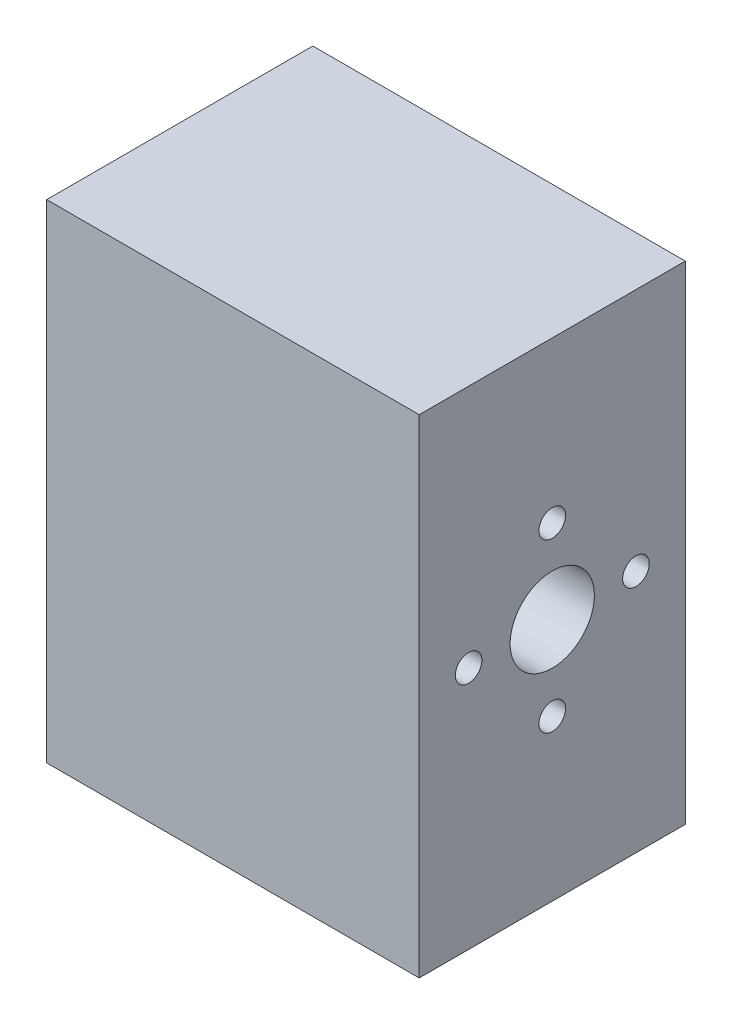
ISO-10303-21;
HEADER;
FILE_DESCRIPTION(('STEP AP214'),'2;1');
FILE_NAME('part.step','',(''),(''),'','','');
FILE_SCHEMA(('AUTOMOTIVE_DESIGN { 1 0 10303 214 1 1 1 1 }'));
ENDSEC;
DATA;
#1=APPLICATION_CONTEXT('core data for automotive mechanical design processes');
#2=APPLICATION_PROTOCOL_DEFINITION('international standard','automotive_design',2000,#1);
#3=PRODUCT_CONTEXT('',#1,'mechanical');
#4=PRODUCT('Part','Part','',(#3));
#5=PRODUCT_RELATED_PRODUCT_CATEGORY('part','',(#4));
#6=PRODUCT_DEFINITION_FORMATION('','',#4);
#7=PRODUCT_DEFINITION_CONTEXT('part definition',#1,'design');
#8=PRODUCT_DEFINITION('design','',#6,#7);
#9=PRODUCT_DEFINITION_SHAPE('','',#8);
#10=(LENGTH_UNIT() NAMED_UNIT(*) SI_UNIT(.MILLI.,.METRE.));
#11=(NAMED_UNIT(*) PLANE_ANGLE_UNIT() SI_UNIT($,.RADIAN.));
#12=(NAMED_UNIT(*) SI_UNIT($,.STERADIAN.) SOLID_ANGLE_UNIT());
#13=UNCERTAINTY_MEASURE_WITH_UNIT(LENGTH_MEASURE(1.E-05),#10,'distance_accuracy_value','');
#14=(GEOMETRIC_REPRESENTATION_CONTEXT(3) GLOBAL_UNCERTAINTY_ASSIGNED_CONTEXT((#13)) GLOBAL_UNIT_ASSIGNED_CONTEXT((#10,
#11,#12)) REPRESENTATION_CONTEXT('',''));
#15=CARTESIAN_POINT('',(0.,0.,0.));
#16=DIRECTION('',(0.,0.,1.));
#17=DIRECTION('',(1.,0.,0.));
#18=AXIS2_PLACEMENT_3D('',#15,#16,#17);
#19=CARTESIAN_POINT('',(0.,0.,30.));
#20=DIRECTION('',(1.,0.,0.));
#21=DIRECTION('',(0.,0.,-1.));
#22=AXIS2_PLACEMENT_3D('',#19,#20,#21);
#23=PLANE('',#22);
#24=CARTESIAN_POINT('',(0.,27.5,24.4344748391705));
#25=DIRECTION('',(1.,0.,0.));
#26=DIRECTION('',(0.,0.,-1.));
#27=AXIS2_PLACEMENT_3D('',#24,#25,#26);
#28=CIRCLE('',#27,1.5);
#29=CARTESIAN_POINT('',(0.,27.5,22.9344748391705));
#30=VERTEX_POINT('',#29);
#31=EDGE_CURVE('E131',#30,#30,#28,.T.);
#32=ORIENTED_EDGE('',*,*,#31,.T.);
#33=EDGE_LOOP('',(#32));
#34=FACE_BOUND('',#33,.T.);
#35=CARTESIAN_POINT('',(0.,18.0655251608295,14.9999999999999));
#36=DIRECTION('',(1.,0.,0.));
#37=DIRECTION('',(0.,0.,-1.));
#38=AXIS2_PLACEMENT_3D('',#35,#36,#37);
#39=CIRCLE('',#38,1.5);
#40=CARTESIAN_POINT('',(0.,18.0655251608295,13.4999999999999));
#41=VERTEX_POINT('',#40);
#42=EDGE_CURVE('E125',#41,#41,#39,.T.);
#43=ORIENTED_EDGE('',*,*,#42,.T.);
#44=EDGE_LOOP('',(#43));
#45=FACE_BOUND('',#44,.T.);
#46=CARTESIAN_POINT('',(0.,27.5000000000001,5.56552516082952));
#47=DIRECTION('',(1.,0.,0.));
#48=DIRECTION('',(0.,0.,-1.));
#49=AXIS2_PLACEMENT_3D('',#46,#47,#48);
#50=CIRCLE('',#49,1.5);
#51=CARTESIAN_POINT('',(0.,27.5000000000001,4.06552516082952));
#52=VERTEX_POINT('',#51);
#53=EDGE_CURVE('E119',#52,#52,#50,.T.);
#54=ORIENTED_EDGE('',*,*,#53,.T.);
#55=EDGE_LOOP('',(#54));
#56=FACE_BOUND('',#55,.T.);
#57=CARTESIAN_POINT('',(0.,36.9344748391705,15.));
#58=DIRECTION('',(1.,0.,0.));
#59=DIRECTION('',(0.,0.,-1.));
#60=AXIS2_PLACEMENT_3D('',#57,#58,#59);
#61=CIRCLE('',#60,1.5);
#62=CARTESIAN_POINT('',(0.,36.9344748391705,13.5));
#63=VERTEX_POINT('',#62);
#64=EDGE_CURVE('E113',#63,#63,#61,.T.);
#65=ORIENTED_EDGE('',*,*,#64,.T.);
#66=EDGE_LOOP('',(#65));
#67=FACE_BOUND('',#66,.T.);
#68=CARTESIAN_POINT('',(0.,27.5,15.));
#69=DIRECTION('',(1.,0.,0.));
#70=DIRECTION('',(0.,0.,-1.));
#71=AXIS2_PLACEMENT_3D('',#68,#69,#70);
#72=CIRCLE('',#71,4.75);
#73=CARTESIAN_POINT('',(0.,27.5,10.25));
#74=VERTEX_POINT('',#73);
#75=EDGE_CURVE('E99',#74,#74,#72,.T.);
#76=ORIENTED_EDGE('',*,*,#75,.T.);
#77=EDGE_LOOP('',(#76));
#78=FACE_BOUND('',#77,.T.);
#79=DIRECTION('',(0.,-1.,0.));
#80=VECTOR('',#79,1.);
#81=CARTESIAN_POINT('',(0.,0.,0.));
#82=LINE('',#81,#80);
#83=CARTESIAN_POINT('',(0.,55.,0.));
#84=VERTEX_POINT('',#83);
#85=CARTESIAN_POINT('',(0.,0.,0.));
#86=VERTEX_POINT('',#85);
#87=EDGE_CURVE('E96',#84,#86,#82,.T.);
#88=ORIENTED_EDGE('',*,*,#87,.T.);
#89=DIRECTION('',(0.,0.,-1.));
#90=VECTOR('',#89,1.);
#91=CARTESIAN_POINT('',(0.,0.,30.));
#92=LINE('',#91,#90);
#93=CARTESIAN_POINT('',(0.,0.,30.));
#94=VERTEX_POINT('',#93);
#95=EDGE_CURVE('E11',#94,#86,#92,.T.);
#96=ORIENTED_EDGE('',*,*,#95,.F.);
#97=DIRECTION('',(0.,-1.,0.));
#98=VECTOR('',#97,1.);
#99=CARTESIAN_POINT('',(0.,0.,30.));
#100=LINE('',#99,#98);
#101=CARTESIAN_POINT('',(0.,55.,30.));
#102=VERTEX_POINT('',#101);
#103=EDGE_CURVE('E84',#102,#94,#100,.T.);
#104=ORIENTED_EDGE('',*,*,#103,.F.);
#105=DIRECTION('',(0.,0.,-1.));
#106=VECTOR('',#105,1.);
#107=CARTESIAN_POINT('',(0.,55.,30.));
#108=LINE('',#107,#106);
#109=EDGE_CURVE('E92',#102,#84,#108,.T.);
#110=ORIENTED_EDGE('',*,*,#109,.T.);
#111=EDGE_LOOP('',(#88,#96,#104,#110));
#112=FACE_BOUND('',#111,.T.);
#113=ADVANCED_FACE('F33',(#34,#45,#56,#67,#78,#112),#23,.F.);
#114=CARTESIAN_POINT('',(0.,0.,30.));
#115=DIRECTION('',(0.,1.,0.));
#116=DIRECTION('',(0.,0.,1.));
#117=AXIS2_PLACEMENT_3D('',#114,#115,#116);
#118=PLANE('',#117);
#119=DIRECTION('',(1.,0.,0.));
#120=VECTOR('',#119,1.);
#121=CARTESIAN_POINT('',(0.,0.,0.));
#122=LINE('',#121,#120);
#123=CARTESIAN_POINT('',(42.,0.,0.));
#124=VERTEX_POINT('',#123);
#125=EDGE_CURVE('E88',#86,#124,#122,.T.);
#126=ORIENTED_EDGE('',*,*,#125,.T.);
#127=DIRECTION('',(0.,0.,-1.));
#128=VECTOR('',#127,1.);
#129=CARTESIAN_POINT('',(42.,0.,30.));
#130=LINE('',#129,#128);
#131=CARTESIAN_POINT('',(42.,0.,30.));
#132=VERTEX_POINT('',#131);
#133=EDGE_CURVE('E41',#132,#124,#130,.T.);
#134=ORIENTED_EDGE('',*,*,#133,.F.);
#135=DIRECTION('',(1.,0.,0.));
#136=VECTOR('',#135,1.);
#137=CARTESIAN_POINT('',(0.,0.,30.));
#138=LINE('',#137,#136);
#139=EDGE_CURVE('E79',#94,#132,#138,.T.);
#140=ORIENTED_EDGE('',*,*,#139,.F.);
#141=ORIENTED_EDGE('',*,*,#95,.T.);
#142=EDGE_LOOP('',(#126,#134,#140,#141));
#143=FACE_BOUND('',#142,.T.);
#144=ADVANCED_FACE('F87',(#143),#118,.F.);
#145=CARTESIAN_POINT('',(42.,0.,30.));
#146=DIRECTION('',(-1.,0.,0.));
#147=DIRECTION('',(0.,0.,1.));
#148=AXIS2_PLACEMENT_3D('',#145,#146,#147);
#149=PLANE('',#148);
#150=CARTESIAN_POINT('',(42.,27.5,24.4344748391705));
#151=DIRECTION('',(1.,0.,0.));
#152=DIRECTION('',(0.,0.,-1.));
#153=AXIS2_PLACEMENT_3D('',#150,#151,#152);
#154=CIRCLE('',#153,1.5);
#155=CARTESIAN_POINT('',(42.,27.5,22.9344748391705));
#156=VERTEX_POINT('',#155);
#157=EDGE_CURVE('E134',#156,#156,#154,.T.);
#158=ORIENTED_EDGE('',*,*,#157,.F.);
#159=EDGE_LOOP('',(#158));
#160=FACE_BOUND('',#159,.T.);
#161=CARTESIAN_POINT('',(42.,18.0655251608295,14.9999999999999));
#162=DIRECTION('',(1.,0.,0.));
#163=DIRECTION('',(0.,0.,-1.));
#164=AXIS2_PLACEMENT_3D('',#161,#162,#163);
#165=CIRCLE('',#164,1.5);
#166=CARTESIAN_POINT('',(42.,18.0655251608295,13.4999999999999));
#167=VERTEX_POINT('',#166);
#168=EDGE_CURVE('E128',#167,#167,#165,.T.);
#169=ORIENTED_EDGE('',*,*,#168,.F.);
#170=EDGE_LOOP('',(#169));
#171=FACE_BOUND('',#170,.T.);
#172=CARTESIAN_POINT('',(42.,27.5000000000001,5.56552516082952));
#173=DIRECTION('',(1.,0.,0.));
#174=DIRECTION('',(0.,0.,-1.));
#175=AXIS2_PLACEMENT_3D('',#172,#173,#174);
#176=CIRCLE('',#175,1.5);
#177=CARTESIAN_POINT('',(42.,27.5000000000001,4.06552516082952));
#178=VERTEX_POINT('',#177);
#179=EDGE_CURVE('E122',#178,#178,#176,.T.);
#180=ORIENTED_EDGE('',*,*,#179,.F.);
#181=EDGE_LOOP('',(#180));
#182=FACE_BOUND('',#181,.T.);
#183=CARTESIAN_POINT('',(42.,36.9344748391705,15.));
#184=DIRECTION('',(1.,0.,0.));
#185=DIRECTION('',(0.,0.,-1.));
#186=AXIS2_PLACEMENT_3D('',#183,#184,#185);
#187=CIRCLE('',#186,1.5);
#188=CARTESIAN_POINT('',(42.,36.9344748391705,13.5));
#189=VERTEX_POINT('',#188);
#190=EDGE_CURVE('E116',#189,#189,#187,.T.);
#191=ORIENTED_EDGE('',*,*,#190,.F.);
#192=EDGE_LOOP('',(#191));
#193=FACE_BOUND('',#192,.T.);
#194=CARTESIAN_POINT('',(42.,27.5,15.));
#195=DIRECTION('',(1.,0.,0.));
#196=DIRECTION('',(0.,0.,-1.));
#197=AXIS2_PLACEMENT_3D('',#194,#195,#196);
#198=CIRCLE('',#197,4.75);
#199=CARTESIAN_POINT('',(42.,27.5,10.25));
#200=VERTEX_POINT('',#199);
#201=EDGE_CURVE('E110',#200,#200,#198,.T.);
#202=ORIENTED_EDGE('',*,*,#201,.F.);
#203=EDGE_LOOP('',(#202));
#204=FACE_BOUND('',#203,.T.);
#205=DIRECTION('',(0.,1.,0.));
#206=VECTOR('',#205,1.);
#207=CARTESIAN_POINT('',(42.,0.,0.));
#208=LINE('',#207,#206);
#209=CARTESIAN_POINT('',(42.,55.,0.));
#210=VERTEX_POINT('',#209);
#211=EDGE_CURVE('E66',#124,#210,#208,.T.);
#212=ORIENTED_EDGE('',*,*,#211,.T.);
#213=DIRECTION('',(0.,0.,-1.));
#214=VECTOR('',#213,1.);
#215=CARTESIAN_POINT('',(42.,55.,30.));
#216=LINE('',#215,#214);
#217=CARTESIAN_POINT('',(42.,55.,30.));
#218=VERTEX_POINT('',#217);
#219=EDGE_CURVE('E89',#218,#210,#216,.T.);
#220=ORIENTED_EDGE('',*,*,#219,.F.);
#221=DIRECTION('',(0.,1.,0.));
#222=VECTOR('',#221,1.);
#223=CARTESIAN_POINT('',(42.,0.,30.));
#224=LINE('',#223,#222);
#225=EDGE_CURVE('E82',#132,#218,#224,.T.);
#226=ORIENTED_EDGE('',*,*,#225,.F.);
#227=ORIENTED_EDGE('',*,*,#133,.T.);
#228=EDGE_LOOP('',(#212,#220,#226,#227));
#229=FACE_BOUND('',#228,.T.);
#230=ADVANCED_FACE('F90',(#160,#171,#182,#193,#204,#229),#149,.F.);
#231=CARTESIAN_POINT('',(0.,55.,30.));
#232=DIRECTION('',(0.,-1.,0.));
#233=DIRECTION('',(0.,0.,-1.));
#234=AXIS2_PLACEMENT_3D('',#231,#232,#233);
#235=PLANE('',#234);
#236=DIRECTION('',(-1.,0.,0.));
#237=VECTOR('',#236,1.);
#238=CARTESIAN_POINT('',(0.,55.,0.));
#239=LINE('',#238,#237);
#240=EDGE_CURVE('E72',#210,#84,#239,.T.);
#241=ORIENTED_EDGE('',*,*,#240,.T.);
#242=ORIENTED_EDGE('',*,*,#109,.F.);
#243=DIRECTION('',(-1.,0.,0.));
#244=VECTOR('',#243,1.);
#245=CARTESIAN_POINT('',(0.,55.,30.));
#246=LINE('',#245,#244);
#247=EDGE_CURVE('E49',#218,#102,#246,.T.);
#248=ORIENTED_EDGE('',*,*,#247,.F.);
#249=ORIENTED_EDGE('',*,*,#219,.T.);
#250=EDGE_LOOP('',(#241,#242,#248,#249));
#251=FACE_BOUND('',#250,.T.);
#252=ADVANCED_FACE('F104',(#251),#235,.F.);
#253=CARTESIAN_POINT('',(0.,0.,30.));
#254=DIRECTION('',(0.,0.,-1.));
#255=DIRECTION('',(-1.,0.,0.));
#256=AXIS2_PLACEMENT_3D('',#253,#254,#255);
#257=PLANE('',#256);
#258=ORIENTED_EDGE('',*,*,#103,.T.);
#259=ORIENTED_EDGE('',*,*,#139,.T.);
#260=ORIENTED_EDGE('',*,*,#225,.T.);
#261=ORIENTED_EDGE('',*,*,#247,.T.);
#262=EDGE_LOOP('',(#258,#259,#260,#261));
#263=FACE_BOUND('',#262,.T.);
#264=ADVANCED_FACE('F80',(#263),#257,.F.);
#265=CARTESIAN_POINT('',(0.,0.,0.));
#266=DIRECTION('',(0.,0.,-1.));
#267=DIRECTION('',(-1.,0.,0.));
#268=AXIS2_PLACEMENT_3D('',#265,#266,#267);
#269=PLANE('',#268);
#270=ORIENTED_EDGE('',*,*,#87,.F.);
#271=ORIENTED_EDGE('',*,*,#240,.F.);
#272=ORIENTED_EDGE('',*,*,#211,.F.);
#273=ORIENTED_EDGE('',*,*,#125,.F.);
#274=EDGE_LOOP('',(#270,#271,#272,#273));
#275=FACE_BOUND('',#274,.T.);
#276=ADVANCED_FACE('F107',(#275),#269,.T.);
#277=CARTESIAN_POINT('',(0.,27.5,15.));
#278=DIRECTION('',(1.,0.,0.));
#279=DIRECTION('',(0.,0.,-1.));
#280=AXIS2_PLACEMENT_3D('',#277,#278,#279);
#281=CYLINDRICAL_SURFACE('',#280,4.75);
#282=CARTESIAN_POINT('',(0.,27.5,10.25));
#283=CARTESIAN_POINT('',(0.437499999999999,27.5,10.25));
#284=CARTESIAN_POINT('',(0.875,27.5,10.25));
#285=CARTESIAN_POINT('',(1.75,27.5,10.25));
#286=CARTESIAN_POINT('',(2.1875,27.5,10.25));
#287=CARTESIAN_POINT('',(3.0625,27.5,10.25));
#288=CARTESIAN_POINT('',(3.5,27.5,10.25));
#289=CARTESIAN_POINT('',(4.375,27.5,10.25));
#290=CARTESIAN_POINT('',(4.8125,27.5,10.25));
#291=CARTESIAN_POINT('',(5.6875,27.5,10.25));
#292=CARTESIAN_POINT('',(6.125,27.5,10.25));
#293=CARTESIAN_POINT('',(7.,27.5,10.25));
#294=CARTESIAN_POINT('',(7.4375,27.5,10.25));
#295=CARTESIAN_POINT('',(8.3125,27.5,10.25));
#296=CARTESIAN_POINT('',(8.75,27.5,10.25));
#297=CARTESIAN_POINT('',(9.625,27.5,10.25));
#298=CARTESIAN_POINT('',(10.0625,27.5,10.25));
#299=CARTESIAN_POINT('',(10.9375,27.5,10.25));
#300=CARTESIAN_POINT('',(11.375,27.5,10.25));
#301=CARTESIAN_POINT('',(12.25,27.5,10.25));
#302=CARTESIAN_POINT('',(12.6875,27.5,10.25));
#303=CARTESIAN_POINT('',(13.5625,27.5,10.25));
#304=CARTESIAN_POINT('',(14.,27.5,10.25));
#305=CARTESIAN_POINT('',(14.875,27.5,10.25));
#306=CARTESIAN_POINT('',(15.3125,27.5,10.25));
#307=CARTESIAN_POINT('',(16.1875,27.5,10.25));
#308=CARTESIAN_POINT('',(16.625,27.5,10.25));
#309=CARTESIAN_POINT('',(17.5,27.5,10.25));
#310=CARTESIAN_POINT('',(17.9375,27.5,10.25));
#311=CARTESIAN_POINT('',(18.8125,27.5,10.25));
#312=CARTESIAN_POINT('',(19.25,27.5,10.25));
#313=CARTESIAN_POINT('',(20.125,27.5,10.25));
#314=CARTESIAN_POINT('',(20.5625,27.5,10.25));
#315=CARTESIAN_POINT('',(21.4375,27.5,10.25));
#316=CARTESIAN_POINT('',(21.875,27.5,10.25));
#317=CARTESIAN_POINT('',(22.75,27.5,10.25));
#318=CARTESIAN_POINT('',(23.1875,27.5,10.25));
#319=CARTESIAN_POINT('',(24.0625,27.5,10.25));
#320=CARTESIAN_POINT('',(24.5,27.5,10.25));
#321=CARTESIAN_POINT('',(25.375,27.5,10.25));
#322=CARTESIAN_POINT('',(25.8125,27.5,10.25));
#323=CARTESIAN_POINT('',(26.6875,27.5,10.25));
#324=CARTESIAN_POINT('',(27.125,27.5,10.25));
#325=CARTESIAN_POINT('',(28.,27.5,10.25));
#326=CARTESIAN_POINT('',(28.4375,27.5,10.25));
#327=CARTESIAN_POINT('',(29.3125,27.5,10.25));
#328=CARTESIAN_POINT('',(29.75,27.5,10.25));
#329=CARTESIAN_POINT('',(30.625,27.5,10.25));
#330=CARTESIAN_POINT('',(31.0625,27.5,10.25));
#331=CARTESIAN_POINT('',(31.9375,27.5,10.25));
#332=CARTESIAN_POINT('',(32.375,27.5,10.25));
#333=CARTESIAN_POINT('',(33.25,27.5,10.25));
#334=CARTESIAN_POINT('',(33.6875,27.5,10.25));
#335=CARTESIAN_POINT('',(34.5625,27.5,10.25));
#336=CARTESIAN_POINT('',(35.,27.5,10.25));
#337=CARTESIAN_POINT('',(35.875,27.5,10.25));
#338=CARTESIAN_POINT('',(36.3125,27.5,10.25));
#339=CARTESIAN_POINT('',(37.1875,27.5,10.25));
#340=CARTESIAN_POINT('',(37.625,27.5,10.25));
#341=CARTESIAN_POINT('',(38.5,27.5,10.25));
#342=CARTESIAN_POINT('',(38.9375,27.5,10.25));
#343=CARTESIAN_POINT('',(39.8125,27.5,10.25));
#344=CARTESIAN_POINT('',(40.25,27.5,10.25));
#345=CARTESIAN_POINT('',(41.125,27.5,10.25));
#346=CARTESIAN_POINT('',(41.5625,27.5,10.25));
#347=CARTESIAN_POINT('',(42.,27.5,10.25));
#348=B_SPLINE_CURVE_WITH_KNOTS('',3,(#282,#283,#284,#285,#286,#287,#288,#289,#290,#291,#292,
#293,#294,#295,#296,#297,#298,#299,#300,#301,#302,#303,#304,#305,#306,#307,#308,#309,#310,#311,
#312,#313,#314,#315,#316,#317,#318,#319,#320,#321,#322,#323,#324,#325,#326,#327,#328,#329,#330,
#331,#332,#333,#334,#335,#336,#337,#338,#339,#340,#341,#342,#343,#344,#345,#346,#347),
.UNSPECIFIED.,.F.,.F.,(4,2,2,2,2,2,2,2,2,2,2,2,2,2,2,2,2,2,2,2,2,2,2,2,2,2,2,2,2,2,2,2,4),(0.,
1.3125,2.625,3.9375,5.25,6.5625,7.875,9.1875,10.5,11.8125,13.125,14.4375,15.75,17.0625,18.375,
19.6875,21.,22.3125,23.625,24.9375,26.25,27.5625,28.875,30.1875,31.5,32.8125,34.125,35.4375,
36.75,38.0625,39.375,40.6875,42.),.UNSPECIFIED.);
#349=EDGE_CURVE('BSEAM160',#74,#200,#348,.T.);
#350=ORIENTED_EDGE('',*,*,#75,.F.);
#351=ORIENTED_EDGE('',*,*,#201,.T.);
#352=ORIENTED_EDGE('',*,*,#349,.T.);
#353=ORIENTED_EDGE('',*,*,#349,.F.);
#354=EDGE_LOOP('',(#350,#352,#351,#353));
#355=FACE_BOUND('',#354,.T.);
#356=ADVANCED_FACE('F160',(#355),#281,.F.);
#357=CARTESIAN_POINT('',(0.,36.9344748391705,15.));
#358=DIRECTION('',(1.,0.,0.));
#359=DIRECTION('',(0.,0.,-1.));
#360=AXIS2_PLACEMENT_3D('',#357,#358,#359);
#361=CYLINDRICAL_SURFACE('',#360,1.5);
#362=CARTESIAN_POINT('',(0.,36.9344748391705,13.5));
#363=CARTESIAN_POINT('',(0.437499999999999,36.9344748391705,13.5));
#364=CARTESIAN_POINT('',(0.875,36.9344748391705,13.5));
#365=CARTESIAN_POINT('',(1.75,36.9344748391705,13.5));
#366=CARTESIAN_POINT('',(2.1875,36.9344748391705,13.5));
#367=CARTESIAN_POINT('',(3.0625,36.9344748391705,13.5));
#368=CARTESIAN_POINT('',(3.5,36.9344748391705,13.5));
#369=CARTESIAN_POINT('',(4.375,36.9344748391705,13.5));
#370=CARTESIAN_POINT('',(4.8125,36.9344748391705,13.5));
#371=CARTESIAN_POINT('',(5.6875,36.9344748391705,13.5));
#372=CARTESIAN_POINT('',(6.125,36.9344748391705,13.5));
#373=CARTESIAN_POINT('',(7.,36.9344748391705,13.5));
#374=CARTESIAN_POINT('',(7.4375,36.9344748391705,13.5));
#375=CARTESIAN_POINT('',(8.3125,36.9344748391705,13.5));
#376=CARTESIAN_POINT('',(8.75,36.9344748391705,13.5));
#377=CARTESIAN_POINT('',(9.625,36.9344748391705,13.5));
#378=CARTESIAN_POINT('',(10.0625,36.9344748391705,13.5));
#379=CARTESIAN_POINT('',(10.9375,36.9344748391705,13.5));
#380=CARTESIAN_POINT('',(11.375,36.9344748391705,13.5));
#381=CARTESIAN_POINT('',(12.25,36.9344748391705,13.5));
#382=CARTESIAN_POINT('',(12.6875,36.9344748391705,13.5));
#383=CARTESIAN_POINT('',(13.5625,36.9344748391705,13.5));
#384=CARTESIAN_POINT('',(14.,36.9344748391705,13.5));
#385=CARTESIAN_POINT('',(14.875,36.9344748391705,13.5));
#386=CARTESIAN_POINT('',(15.3125,36.9344748391705,13.5));
#387=CARTESIAN_POINT('',(16.1875,36.9344748391705,13.5));
#388=CARTESIAN_POINT('',(16.625,36.9344748391705,13.5));
#389=CARTESIAN_POINT('',(17.5,36.9344748391705,13.5));
#390=CARTESIAN_POINT('',(17.9375,36.9344748391705,13.5));
#391=CARTESIAN_POINT('',(18.8125,36.9344748391705,13.5));
#392=CARTESIAN_POINT('',(19.25,36.9344748391705,13.5));
#393=CARTESIAN_POINT('',(20.125,36.9344748391705,13.5));
#394=CARTESIAN_POINT('',(20.5625,36.9344748391705,13.5));
#395=CARTESIAN_POINT('',(21.4375,36.9344748391705,13.5));
#396=CARTESIAN_POINT('',(21.875,36.9344748391705,13.5));
#397=CARTESIAN_POINT('',(22.75,36.9344748391705,13.5));
#398=CARTESIAN_POINT('',(23.1875,36.9344748391705,13.5));
#399=CARTESIAN_POINT('',(24.0625,36.9344748391705,13.5));
#400=CARTESIAN_POINT('',(24.5,36.9344748391705,13.5));
#401=CARTESIAN_POINT('',(25.375,36.9344748391705,13.5));
#402=CARTESIAN_POINT('',(25.8125,36.9344748391705,13.5));
#403=CARTESIAN_POINT('',(26.6875,36.9344748391705,13.5));
#404=CARTESIAN_POINT('',(27.125,36.9344748391705,13.5));
#405=CARTESIAN_POINT('',(28.,36.9344748391705,13.5));
#406=CARTESIAN_POINT('',(28.4375,36.9344748391705,13.5));
#407=CARTESIAN_POINT('',(29.3125,36.9344748391705,13.5));
#408=CARTESIAN_POINT('',(29.75,36.9344748391705,13.5));
#409=CARTESIAN_POINT('',(30.625,36.9344748391705,13.5));
#410=CARTESIAN_POINT('',(31.0625,36.9344748391705,13.5));
#411=CARTESIAN_POINT('',(31.9375,36.9344748391705,13.5));
#412=CARTESIAN_POINT('',(32.375,36.9344748391705,13.5));
#413=CARTESIAN_POINT('',(33.25,36.9344748391705,13.5));
#414=CARTESIAN_POINT('',(33.6875,36.9344748391705,13.5));
#415=CARTESIAN_POINT('',(34.5625,36.9344748391705,13.5));
#416=CARTESIAN_POINT('',(35.,36.9344748391705,13.5));
#417=CARTESIAN_POINT('',(35.875,36.9344748391705,13.5));
#418=CARTESIAN_POINT('',(36.3125,36.9344748391705,13.5));
#419=CARTESIAN_POINT('',(37.1875,36.9344748391705,13.5));
#420=CARTESIAN_POINT('',(37.625,36.9344748391705,13.5));
#421=CARTESIAN_POINT('',(38.5,36.9344748391705,13.5));
#422=CARTESIAN_POINT('',(38.9375,36.9344748391705,13.5));
#423=CARTESIAN_POINT('',(39.8125,36.9344748391705,13.5));
#424=CARTESIAN_POINT('',(40.25,36.9344748391705,13.5));
#425=CARTESIAN_POINT('',(41.125,36.9344748391705,13.5));
#426=CARTESIAN_POINT('',(41.5625,36.9344748391705,13.5));
#427=CARTESIAN_POINT('',(42.,36.9344748391705,13.5));
#428=B_SPLINE_CURVE_WITH_KNOTS('',3,(#362,#363,#364,#365,#366,#367,#368,#369,#370,#371,#372,
#373,#374,#375,#376,#377,#378,#379,#380,#381,#382,#383,#384,#385,#386,#387,#388,#389,#390,#391,
#392,#393,#394,#395,#396,#397,#398,#399,#400,#401,#402,#403,#404,#405,#406,#407,#408,#409,#410,
#411,#412,#413,#414,#415,#416,#417,#418,#419,#420,#421,#422,#423,#424,#425,#426,#427),
.UNSPECIFIED.,.F.,.F.,(4,2,2,2,2,2,2,2,2,2,2,2,2,2,2,2,2,2,2,2,2,2,2,2,2,2,2,2,2,2,2,2,4),(0.,
1.3125,2.625,3.9375,5.25,6.5625,7.875,9.1875,10.5,11.8125,13.125,14.4375,15.75,17.0625,18.375,
19.6875,21.,22.3125,23.625,24.9375,26.25,27.5625,28.875,30.1875,31.5,32.8125,34.125,35.4375,
36.75,38.0625,39.375,40.6875,42.),.UNSPECIFIED.);
#429=EDGE_CURVE('BSEAM162',#63,#189,#428,.T.);
#430=ORIENTED_EDGE('',*,*,#64,.F.);
#431=ORIENTED_EDGE('',*,*,#190,.T.);
#432=ORIENTED_EDGE('',*,*,#429,.T.);
#433=ORIENTED_EDGE('',*,*,#429,.F.);
#434=EDGE_LOOP('',(#430,#432,#431,#433));
#435=FACE_BOUND('',#434,.T.);
#436=ADVANCED_FACE('F162',(#435),#361,.F.);
#437=CARTESIAN_POINT('',(0.,27.5000000000001,5.56552516082952));
#438=DIRECTION('',(1.,0.,0.));
#439=DIRECTION('',(0.,0.,-1.));
#440=AXIS2_PLACEMENT_3D('',#437,#438,#439);
#441=CYLINDRICAL_SURFACE('',#440,1.5);
#442=CARTESIAN_POINT('',(0.,27.5000000000001,4.06552516082952));
#443=CARTESIAN_POINT('',(0.437499999999999,27.5000000000001,4.06552516082952));
#444=CARTESIAN_POINT('',(0.875,27.5000000000001,4.06552516082952));
#445=CARTESIAN_POINT('',(1.75,27.5000000000001,4.06552516082952));
#446=CARTESIAN_POINT('',(2.1875,27.5000000000001,4.06552516082952));
#447=CARTESIAN_POINT('',(3.0625,27.5000000000001,4.06552516082952));
#448=CARTESIAN_POINT('',(3.5,27.5000000000001,4.06552516082952));
#449=CARTESIAN_POINT('',(4.375,27.5000000000001,4.06552516082952));
#450=CARTESIAN_POINT('',(4.8125,27.5000000000001,4.06552516082952));
#451=CARTESIAN_POINT('',(5.6875,27.5000000000001,4.06552516082952));
#452=CARTESIAN_POINT('',(6.125,27.5000000000001,4.06552516082952));
#453=CARTESIAN_POINT('',(7.,27.5000000000001,4.06552516082952));
#454=CARTESIAN_POINT('',(7.4375,27.5000000000001,4.06552516082952));
#455=CARTESIAN_POINT('',(8.3125,27.5000000000001,4.06552516082952));
#456=CARTESIAN_POINT('',(8.75,27.5000000000001,4.06552516082952));
#457=CARTESIAN_POINT('',(9.625,27.5000000000001,4.06552516082952));
#458=CARTESIAN_POINT('',(10.0625,27.5000000000001,4.06552516082952));
#459=CARTESIAN_POINT('',(10.9375,27.5000000000001,4.06552516082952));
#460=CARTESIAN_POINT('',(11.375,27.5000000000001,4.06552516082952));
#461=CARTESIAN_POINT('',(12.25,27.5000000000001,4.06552516082952));
#462=CARTESIAN_POINT('',(12.6875,27.5000000000001,4.06552516082952));
#463=CARTESIAN_POINT('',(13.5625,27.5000000000001,4.06552516082952));
#464=CARTESIAN_POINT('',(14.,27.5000000000001,4.06552516082952));
#465=CARTESIAN_POINT('',(14.875,27.5000000000001,4.06552516082952));
#466=CARTESIAN_POINT('',(15.3125,27.5000000000001,4.06552516082952));
#467=CARTESIAN_POINT('',(16.1875,27.5000000000001,4.06552516082952));
#468=CARTESIAN_POINT('',(16.625,27.5000000000001,4.06552516082952));
#469=CARTESIAN_POINT('',(17.5,27.5000000000001,4.06552516082952));
#470=CARTESIAN_POINT('',(17.9375,27.5000000000001,4.06552516082952));
#471=CARTESIAN_POINT('',(18.8125,27.5000000000001,4.06552516082952));
#472=CARTESIAN_POINT('',(19.25,27.5000000000001,4.06552516082952));
#473=CARTESIAN_POINT('',(20.125,27.5000000000001,4.06552516082952));
#474=CARTESIAN_POINT('',(20.5625,27.5000000000001,4.06552516082952));
#475=CARTESIAN_POINT('',(21.4375,27.5000000000001,4.06552516082952));
#476=CARTESIAN_POINT('',(21.875,27.5000000000001,4.06552516082952));
#477=CARTESIAN_POINT('',(22.75,27.5000000000001,4.06552516082952));
#478=CARTESIAN_POINT('',(23.1875,27.5000000000001,4.06552516082952));
#479=CARTESIAN_POINT('',(24.0625,27.5000000000001,4.06552516082952));
#480=CARTESIAN_POINT('',(24.5,27.5000000000001,4.06552516082952));
#481=CARTESIAN_POINT('',(25.375,27.5000000000001,4.06552516082952));
#482=CARTESIAN_POINT('',(25.8125,27.5000000000001,4.06552516082952));
#483=CARTESIAN_POINT('',(26.6875,27.5000000000001,4.06552516082952));
#484=CARTESIAN_POINT('',(27.125,27.5000000000001,4.06552516082952));
#485=CARTESIAN_POINT('',(28.,27.5000000000001,4.06552516082952));
#486=CARTESIAN_POINT('',(28.4375,27.5000000000001,4.06552516082952));
#487=CARTESIAN_POINT('',(29.3125,27.5000000000001,4.06552516082952));
#488=CARTESIAN_POINT('',(29.75,27.5000000000001,4.06552516082952));
#489=CARTESIAN_POINT('',(30.625,27.5000000000001,4.06552516082952));
#490=CARTESIAN_POINT('',(31.0625,27.5000000000001,4.06552516082952));
#491=CARTESIAN_POINT('',(31.9375,27.5000000000001,4.06552516082952));
#492=CARTESIAN_POINT('',(32.375,27.5000000000001,4.06552516082952));
#493=CARTESIAN_POINT('',(33.25,27.5000000000001,4.06552516082952));
#494=CARTESIAN_POINT('',(33.6875,27.5000000000001,4.06552516082952));
#495=CARTESIAN_POINT('',(34.5625,27.5000000000001,4.06552516082952));
#496=CARTESIAN_POINT('',(35.,27.5000000000001,4.06552516082952));
#497=CARTESIAN_POINT('',(35.875,27.5000000000001,4.06552516082952));
#498=CARTESIAN_POINT('',(36.3125,27.5000000000001,4.06552516082952));
#499=CARTESIAN_POINT('',(37.1875,27.5000000000001,4.06552516082952));
#500=CARTESIAN_POINT('',(37.625,27.5000000000001,4.06552516082952));
#501=CARTESIAN_POINT('',(38.5,27.5000000000001,4.06552516082952));
#502=CARTESIAN_POINT('',(38.9375,27.5000000000001,4.06552516082952));
#503=CARTESIAN_POINT('',(39.8125,27.5000000000001,4.06552516082952));
#504=CARTESIAN_POINT('',(40.25,27.5000000000001,4.06552516082952));
#505=CARTESIAN_POINT('',(41.125,27.5000000000001,4.06552516082952));
#506=CARTESIAN_POINT('',(41.5625,27.5000000000001,4.06552516082952));
#507=CARTESIAN_POINT('',(42.,27.5000000000001,4.06552516082952));
#508=B_SPLINE_CURVE_WITH_KNOTS('',3,(#442,#443,#444,#445,#446,#447,#448,#449,#450,#451,#452,
#453,#454,#455,#456,#457,#458,#459,#460,#461,#462,#463,#464,#465,#466,#467,#468,#469,#470,#471,
#472,#473,#474,#475,#476,#477,#478,#479,#480,#481,#482,#483,#484,#485,#486,#487,#488,#489,#490,
#491,#492,#493,#494,#495,#496,#497,#498,#499,#500,#501,#502,#503,#504,#505,#506,#507),
.UNSPECIFIED.,.F.,.F.,(4,2,2,2,2,2,2,2,2,2,2,2,2,2,2,2,2,2,2,2,2,2,2,2,2,2,2,2,2,2,2,2,4),(0.,
1.3125,2.625,3.9375,5.25,6.5625,7.875,9.1875,10.5,11.8125,13.125,14.4375,15.75,17.0625,18.375,
19.6875,21.,22.3125,23.625,24.9375,26.25,27.5625,28.875,30.1875,31.5,32.8125,34.125,35.4375,
36.75,38.0625,39.375,40.6875,42.),.UNSPECIFIED.);
#509=EDGE_CURVE('BSEAM169',#52,#178,#508,.T.);
#510=ORIENTED_EDGE('',*,*,#53,.F.);
#511=ORIENTED_EDGE('',*,*,#179,.T.);
#512=ORIENTED_EDGE('',*,*,#509,.T.);
#513=ORIENTED_EDGE('',*,*,#509,.F.);
#514=EDGE_LOOP('',(#510,#512,#511,#513));
#515=FACE_BOUND('',#514,.T.);
#516=ADVANCED_FACE('F169',(#515),#441,.F.);
#517=CARTESIAN_POINT('',(0.,18.0655251608295,14.9999999999999));
#518=DIRECTION('',(1.,0.,0.));
#519=DIRECTION('',(0.,0.,-1.));
#520=AXIS2_PLACEMENT_3D('',#517,#518,#519);
#521=CYLINDRICAL_SURFACE('',#520,1.5);
#522=CARTESIAN_POINT('',(0.,18.0655251608295,13.4999999999999));
#523=CARTESIAN_POINT('',(0.437499999999999,18.0655251608295,13.4999999999999));
#524=CARTESIAN_POINT('',(0.875,18.0655251608295,13.4999999999999));
#525=CARTESIAN_POINT('',(1.75,18.0655251608295,13.4999999999999));
#526=CARTESIAN_POINT('',(2.1875,18.0655251608295,13.4999999999999));
#527=CARTESIAN_POINT('',(3.0625,18.0655251608295,13.4999999999999));
#528=CARTESIAN_POINT('',(3.5,18.0655251608295,13.4999999999999));
#529=CARTESIAN_POINT('',(4.375,18.0655251608295,13.4999999999999));
#530=CARTESIAN_POINT('',(4.8125,18.0655251608295,13.4999999999999));
#531=CARTESIAN_POINT('',(5.6875,18.0655251608295,13.4999999999999));
#532=CARTESIAN_POINT('',(6.125,18.0655251608295,13.4999999999999));
#533=CARTESIAN_POINT('',(7.,18.0655251608295,13.4999999999999));
#534=CARTESIAN_POINT('',(7.4375,18.0655251608295,13.4999999999999));
#535=CARTESIAN_POINT('',(8.3125,18.0655251608295,13.4999999999999));
#536=CARTESIAN_POINT('',(8.75,18.0655251608295,13.4999999999999));
#537=CARTESIAN_POINT('',(9.625,18.0655251608295,13.4999999999999));
#538=CARTESIAN_POINT('',(10.0625,18.0655251608295,13.4999999999999));
#539=CARTESIAN_POINT('',(10.9375,18.0655251608295,13.4999999999999));
#540=CARTESIAN_POINT('',(11.375,18.0655251608295,13.4999999999999));
#541=CARTESIAN_POINT('',(12.25,18.0655251608295,13.4999999999999));
#542=CARTESIAN_POINT('',(12.6875,18.0655251608295,13.4999999999999));
#543=CARTESIAN_POINT('',(13.5625,18.0655251608295,13.4999999999999));
#544=CARTESIAN_POINT('',(14.,18.0655251608295,13.4999999999999));
#545=CARTESIAN_POINT('',(14.875,18.0655251608295,13.4999999999999));
#546=CARTESIAN_POINT('',(15.3125,18.0655251608295,13.4999999999999));
#547=CARTESIAN_POINT('',(16.1875,18.0655251608295,13.4999999999999));
#548=CARTESIAN_POINT('',(16.625,18.0655251608295,13.4999999999999));
#549=CARTESIAN_POINT('',(17.5,18.0655251608295,13.4999999999999));
#550=CARTESIAN_POINT('',(17.9375,18.0655251608295,13.4999999999999));
#551=CARTESIAN_POINT('',(18.8125,18.0655251608295,13.4999999999999));
#552=CARTESIAN_POINT('',(19.25,18.0655251608295,13.4999999999999));
#553=CARTESIAN_POINT('',(20.125,18.0655251608295,13.4999999999999));
#554=CARTESIAN_POINT('',(20.5625,18.0655251608295,13.4999999999999));
#555=CARTESIAN_POINT('',(21.4375,18.0655251608295,13.4999999999999));
#556=CARTESIAN_POINT('',(21.875,18.0655251608295,13.4999999999999));
#557=CARTESIAN_POINT('',(22.75,18.0655251608295,13.4999999999999));
#558=CARTESIAN_POINT('',(23.1875,18.0655251608295,13.4999999999999));
#559=CARTESIAN_POINT('',(24.0625,18.0655251608295,13.4999999999999));
#560=CARTESIAN_POINT('',(24.5,18.0655251608295,13.4999999999999));
#561=CARTESIAN_POINT('',(25.375,18.0655251608295,13.4999999999999));
#562=CARTESIAN_POINT('',(25.8125,18.0655251608295,13.4999999999999));
#563=CARTESIAN_POINT('',(26.6875,18.0655251608295,13.4999999999999));
#564=CARTESIAN_POINT('',(27.125,18.0655251608295,13.4999999999999));
#565=CARTESIAN_POINT('',(28.,18.0655251608295,13.4999999999999));
#566=CARTESIAN_POINT('',(28.4375,18.0655251608295,13.4999999999999));
#567=CARTESIAN_POINT('',(29.3125,18.0655251608295,13.4999999999999));
#568=CARTESIAN_POINT('',(29.75,18.0655251608295,13.4999999999999));
#569=CARTESIAN_POINT('',(30.625,18.0655251608295,13.4999999999999));
#570=CARTESIAN_POINT('',(31.0625,18.0655251608295,13.4999999999999));
#571=CARTESIAN_POINT('',(31.9375,18.0655251608295,13.4999999999999));
#572=CARTESIAN_POINT('',(32.375,18.0655251608295,13.4999999999999));
#573=CARTESIAN_POINT('',(33.25,18.0655251608295,13.4999999999999));
#574=CARTESIAN_POINT('',(33.6875,18.0655251608295,13.4999999999999));
#575=CARTESIAN_POINT('',(34.5625,18.0655251608295,13.4999999999999));
#576=CARTESIAN_POINT('',(35.,18.0655251608295,13.4999999999999));
#577=CARTESIAN_POINT('',(35.875,18.0655251608295,13.4999999999999));
#578=CARTESIAN_POINT('',(36.3125,18.0655251608295,13.4999999999999));
#579=CARTESIAN_POINT('',(37.1875,18.0655251608295,13.4999999999999));
#580=CARTESIAN_POINT('',(37.625,18.0655251608295,13.4999999999999));
#581=CARTESIAN_POINT('',(38.5,18.0655251608295,13.4999999999999));
#582=CARTESIAN_POINT('',(38.9375,18.0655251608295,13.4999999999999));
#583=CARTESIAN_POINT('',(39.8125,18.0655251608295,13.4999999999999));
#584=CARTESIAN_POINT('',(40.25,18.0655251608295,13.4999999999999));
#585=CARTESIAN_POINT('',(41.125,18.0655251608295,13.4999999999999));
#586=CARTESIAN_POINT('',(41.5625,18.0655251608295,13.4999999999999));
#587=CARTESIAN_POINT('',(42.,18.0655251608295,13.4999999999999));
#588=B_SPLINE_CURVE_WITH_KNOTS('',3,(#522,#523,#524,#525,#526,#527,#528,#529,#530,#531,#532,
#533,#534,#535,#536,#537,#538,#539,#540,#541,#542,#543,#544,#545,#546,#547,#548,#549,#550,#551,
#552,#553,#554,#555,#556,#557,#558,#559,#560,#561,#562,#563,#564,#565,#566,#567,#568,#569,#570,
#571,#572,#573,#574,#575,#576,#577,#578,#579,#580,#581,#582,#583,#584,#585,#586,#587),
.UNSPECIFIED.,.F.,.F.,(4,2,2,2,2,2,2,2,2,2,2,2,2,2,2,2,2,2,2,2,2,2,2,2,2,2,2,2,2,2,2,2,4),(0.,
1.3125,2.625,3.9375,5.25,6.5625,7.875,9.1875,10.5,11.8125,13.125,14.4375,15.75,17.0625,18.375,
19.6875,21.,22.3125,23.625,24.9375,26.25,27.5625,28.875,30.1875,31.5,32.8125,34.125,35.4375,
36.75,38.0625,39.375,40.6875,42.),.UNSPECIFIED.);
#589=EDGE_CURVE('BSEAM145',#41,#167,#588,.T.);
#590=ORIENTED_EDGE('',*,*,#42,.F.);
#591=ORIENTED_EDGE('',*,*,#168,.T.);
#592=ORIENTED_EDGE('',*,*,#589,.T.);
#593=ORIENTED_EDGE('',*,*,#589,.F.);
#594=EDGE_LOOP('',(#590,#592,#591,#593));
#595=FACE_BOUND('',#594,.T.);
#596=ADVANCED_FACE('F145',(#595),#521,.F.);
#597=CARTESIAN_POINT('',(0.,27.5,24.4344748391705));
#598=DIRECTION('',(1.,0.,0.));
#599=DIRECTION('',(0.,0.,-1.));
#600=AXIS2_PLACEMENT_3D('',#597,#598,#599);
#601=CYLINDRICAL_SURFACE('',#600,1.5);
#602=CARTESIAN_POINT('',(0.,27.5,22.9344748391705));
#603=CARTESIAN_POINT('',(0.437499999999999,27.5,22.9344748391705));
#604=CARTESIAN_POINT('',(0.875,27.5,22.9344748391705));
#605=CARTESIAN_POINT('',(1.75,27.5,22.9344748391705));
#606=CARTESIAN_POINT('',(2.1875,27.5,22.9344748391705));
#607=CARTESIAN_POINT('',(3.0625,27.5,22.9344748391705));
#608=CARTESIAN_POINT('',(3.5,27.5,22.9344748391705));
#609=CARTESIAN_POINT('',(4.375,27.5,22.9344748391705));
#610=CARTESIAN_POINT('',(4.8125,27.5,22.9344748391705));
#611=CARTESIAN_POINT('',(5.6875,27.5,22.9344748391705));
#612=CARTESIAN_POINT('',(6.125,27.5,22.9344748391705));
#613=CARTESIAN_POINT('',(7.,27.5,22.9344748391705));
#614=CARTESIAN_POINT('',(7.4375,27.5,22.9344748391705));
#615=CARTESIAN_POINT('',(8.3125,27.5,22.9344748391705));
#616=CARTESIAN_POINT('',(8.75,27.5,22.9344748391705));
#617=CARTESIAN_POINT('',(9.625,27.5,22.9344748391705));
#618=CARTESIAN_POINT('',(10.0625,27.5,22.9344748391705));
#619=CARTESIAN_POINT('',(10.9375,27.5,22.9344748391705));
#620=CARTESIAN_POINT('',(11.375,27.5,22.9344748391705));
#621=CARTESIAN_POINT('',(12.25,27.5,22.9344748391705));
#622=CARTESIAN_POINT('',(12.6875,27.5,22.9344748391705));
#623=CARTESIAN_POINT('',(13.5625,27.5,22.9344748391705));
#624=CARTESIAN_POINT('',(14.,27.5,22.9344748391705));
#625=CARTESIAN_POINT('',(14.875,27.5,22.9344748391705));
#626=CARTESIAN_POINT('',(15.3125,27.5,22.9344748391705));
#627=CARTESIAN_POINT('',(16.1875,27.5,22.9344748391705));
#628=CARTESIAN_POINT('',(16.625,27.5,22.9344748391705));
#629=CARTESIAN_POINT('',(17.5,27.5,22.9344748391705));
#630=CARTESIAN_POINT('',(17.9375,27.5,22.9344748391705));
#631=CARTESIAN_POINT('',(18.8125,27.5,22.9344748391705));
#632=CARTESIAN_POINT('',(19.25,27.5,22.9344748391705));
#633=CARTESIAN_POINT('',(20.125,27.5,22.9344748391705));
#634=CARTESIAN_POINT('',(20.5625,27.5,22.9344748391705));
#635=CARTESIAN_POINT('',(21.4375,27.5,22.9344748391705));
#636=CARTESIAN_POINT('',(21.875,27.5,22.9344748391705));
#637=CARTESIAN_POINT('',(22.75,27.5,22.9344748391705));
#638=CARTESIAN_POINT('',(23.1875,27.5,22.9344748391705));
#639=CARTESIAN_POINT('',(24.0625,27.5,22.9344748391705));
#640=CARTESIAN_POINT('',(24.5,27.5,22.9344748391705));
#641=CARTESIAN_POINT('',(25.375,27.5,22.9344748391705));
#642=CARTESIAN_POINT('',(25.8125,27.5,22.9344748391705));
#643=CARTESIAN_POINT('',(26.6875,27.5,22.9344748391705));
#644=CARTESIAN_POINT('',(27.125,27.5,22.9344748391705));
#645=CARTESIAN_POINT('',(28.,27.5,22.9344748391705));
#646=CARTESIAN_POINT('',(28.4375,27.5,22.9344748391705));
#647=CARTESIAN_POINT('',(29.3125,27.5,22.9344748391705));
#648=CARTESIAN_POINT('',(29.75,27.5,22.9344748391705));
#649=CARTESIAN_POINT('',(30.625,27.5,22.9344748391705));
#650=CARTESIAN_POINT('',(31.0625,27.5,22.9344748391705));
#651=CARTESIAN_POINT('',(31.9375,27.5,22.9344748391705));
#652=CARTESIAN_POINT('',(32.375,27.5,22.9344748391705));
#653=CARTESIAN_POINT('',(33.25,27.5,22.9344748391705));
#654=CARTESIAN_POINT('',(33.6875,27.5,22.9344748391705));
#655=CARTESIAN_POINT('',(34.5625,27.5,22.9344748391705));
#656=CARTESIAN_POINT('',(35.,27.5,22.9344748391705));
#657=CARTESIAN_POINT('',(35.875,27.5,22.9344748391705));
#658=CARTESIAN_POINT('',(36.3125,27.5,22.9344748391705));
#659=CARTESIAN_POINT('',(37.1875,27.5,22.9344748391705));
#660=CARTESIAN_POINT('',(37.625,27.5,22.9344748391705));
#661=CARTESIAN_POINT('',(38.5,27.5,22.9344748391705));
#662=CARTESIAN_POINT('',(38.9375,27.5,22.9344748391705));
#663=CARTESIAN_POINT('',(39.8125,27.5,22.9344748391705));
#664=CARTESIAN_POINT('',(40.25,27.5,22.9344748391705));
#665=CARTESIAN_POINT('',(41.125,27.5,22.9344748391705));
#666=CARTESIAN_POINT('',(41.5625,27.5,22.9344748391705));
#667=CARTESIAN_POINT('',(42.,27.5,22.9344748391705));
#668=B_SPLINE_CURVE_WITH_KNOTS('',3,(#602,#603,#604,#605,#606,#607,#608,#609,#610,#611,#612,
#613,#614,#615,#616,#617,#618,#619,#620,#621,#622,#623,#624,#625,#626,#627,#628,#629,#630,#631,
#632,#633,#634,#635,#636,#637,#638,#639,#640,#641,#642,#643,#644,#645,#646,#647,#648,#649,#650,
#651,#652,#653,#654,#655,#656,#657,#658,#659,#660,#661,#662,#663,#664,#665,#666,#667),
.UNSPECIFIED.,.F.,.F.,(4,2,2,2,2,2,2,2,2,2,2,2,2,2,2,2,2,2,2,2,2,2,2,2,2,2,2,2,2,2,2,2,4),(0.,
1.3125,2.625,3.9375,5.25,6.5625,7.875,9.1875,10.5,11.8125,13.125,14.4375,15.75,17.0625,18.375,
19.6875,21.,22.3125,23.625,24.9375,26.25,27.5625,28.875,30.1875,31.5,32.8125,34.125,35.4375,
36.75,38.0625,39.375,40.6875,42.),.UNSPECIFIED.);
#669=EDGE_CURVE('BSEAM142',#30,#156,#668,.T.);
#670=ORIENTED_EDGE('',*,*,#31,.F.);
#671=ORIENTED_EDGE('',*,*,#157,.T.);
#672=ORIENTED_EDGE('',*,*,#669,.T.);
#673=ORIENTED_EDGE('',*,*,#669,.F.);
#674=EDGE_LOOP('',(#670,#672,#671,#673));
#675=FACE_BOUND('',#674,.T.);
#676=ADVANCED_FACE('F142',(#675),#601,.F.);
#677=CLOSED_SHELL('',(#113,#144,#230,#252,#264,#276,#356,#436,#516,#596,#676));
#678=MANIFOLD_SOLID_BREP('B2',#677);
#679=ADVANCED_BREP_SHAPE_REPRESENTATION('',(#18,#678),#14);
#680=SHAPE_DEFINITION_REPRESENTATION(#9,#679);
ENDSEC;
END-ISO-10303-21;
